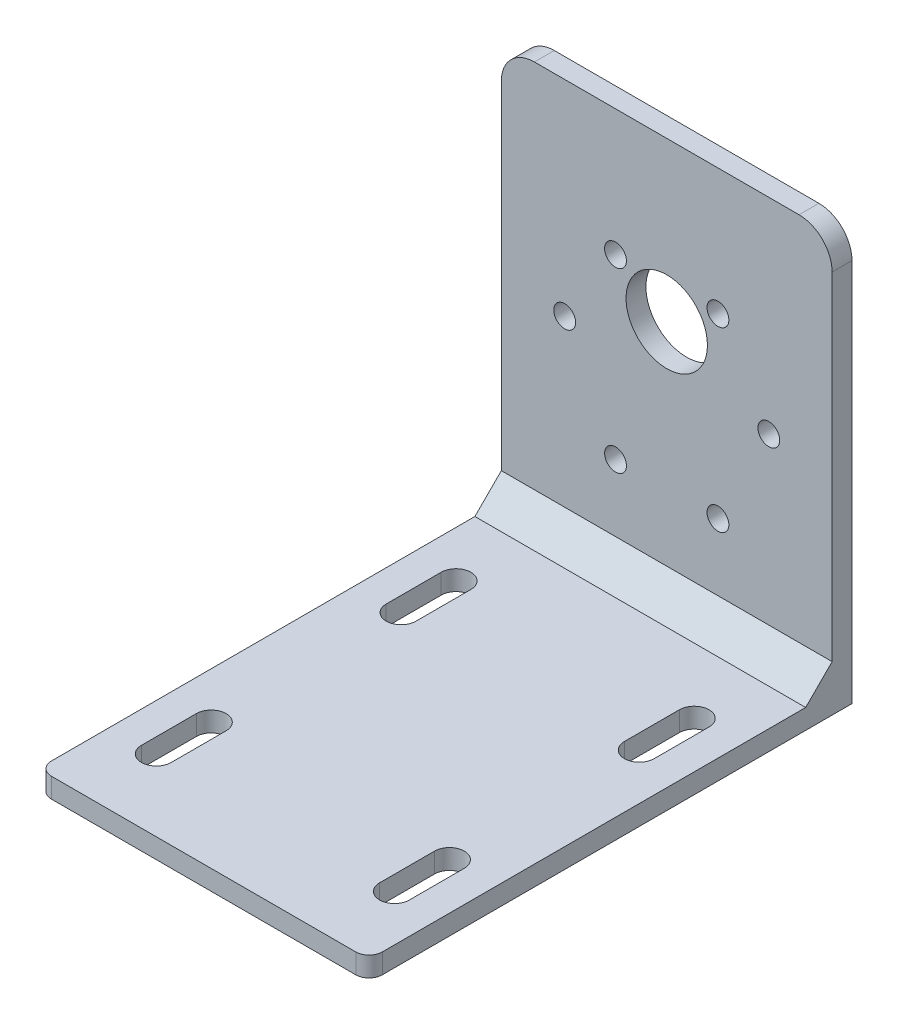
ISO-10303-21;
HEADER;
FILE_DESCRIPTION(('STEP AP214'),'2;1');
FILE_NAME('part.step','',(''),(''),'','','');
FILE_SCHEMA(('AUTOMOTIVE_DESIGN { 1 0 10303 214 1 1 1 1 }'));
ENDSEC;
DATA;
#1=APPLICATION_CONTEXT('core data for automotive mechanical design processes');
#2=APPLICATION_PROTOCOL_DEFINITION('international standard','automotive_design',2000,#1);
#3=PRODUCT_CONTEXT('',#1,'mechanical');
#4=PRODUCT('Part','Part','',(#3));
#5=PRODUCT_RELATED_PRODUCT_CATEGORY('part','',(#4));
#6=PRODUCT_DEFINITION_FORMATION('','',#4);
#7=PRODUCT_DEFINITION_CONTEXT('part definition',#1,'design');
#8=PRODUCT_DEFINITION('design','',#6,#7);
#9=PRODUCT_DEFINITION_SHAPE('','',#8);
#10=(LENGTH_UNIT() NAMED_UNIT(*) SI_UNIT(.MILLI.,.METRE.));
#11=(NAMED_UNIT(*) PLANE_ANGLE_UNIT() SI_UNIT($,.RADIAN.));
#12=(NAMED_UNIT(*) SI_UNIT($,.STERADIAN.) SOLID_ANGLE_UNIT());
#13=UNCERTAINTY_MEASURE_WITH_UNIT(LENGTH_MEASURE(1.E-05),#10,'distance_accuracy_value','');
#14=(GEOMETRIC_REPRESENTATION_CONTEXT(3) GLOBAL_UNCERTAINTY_ASSIGNED_CONTEXT((#13)) GLOBAL_UNIT_ASSIGNED_CONTEXT((#10,
#11,#12)) REPRESENTATION_CONTEXT('',''));
#15=CARTESIAN_POINT('',(0.,0.,0.));
#16=DIRECTION('',(0.,0.,1.));
#17=DIRECTION('',(1.,0.,0.));
#18=AXIS2_PLACEMENT_3D('',#15,#16,#17);
#19=CARTESIAN_POINT('',(25.,-30.,73.));
#20=DIRECTION('',(0.,-1.,0.));
#21=DIRECTION('',(1.,0.,0.));
#22=AXIS2_PLACEMENT_3D('',#19,#20,#21);
#23=PLANE('',#22);
#24=DIRECTION('',(0.,0.,1.));
#25=VECTOR('',#24,1.);
#26=CARTESIAN_POINT('',(-15.75,-30.,16.85));
#27=LINE('',#26,#25);
#28=CARTESIAN_POINT('',(-15.75,-30.,16.85));
#29=VERTEX_POINT('',#28);
#30=CARTESIAN_POINT('',(-15.75,-30.,25.15));
#31=VERTEX_POINT('',#30);
#32=EDGE_CURVE('E848',#29,#31,#27,.T.);
#33=ORIENTED_EDGE('',*,*,#32,.T.);
#34=CARTESIAN_POINT('',(-18.,-30.,25.15));
#35=DIRECTION('',(0.,1.,0.));
#36=DIRECTION('',(-1.,0.,0.));
#37=AXIS2_PLACEMENT_3D('',#34,#35,#36);
#38=CIRCLE('',#37,2.25);
#39=CARTESIAN_POINT('',(-20.25,-30.,25.15));
#40=VERTEX_POINT('',#39);
#41=EDGE_CURVE('E845',#40,#31,#38,.T.);
#42=ORIENTED_EDGE('',*,*,#41,.F.);
#43=DIRECTION('',(0.,0.,1.));
#44=VECTOR('',#43,1.);
#45=CARTESIAN_POINT('',(-20.25,-30.,16.85));
#46=LINE('',#45,#44);
#47=CARTESIAN_POINT('',(-20.25,-30.,16.85));
#48=VERTEX_POINT('',#47);
#49=EDGE_CURVE('E842',#48,#40,#46,.T.);
#50=ORIENTED_EDGE('',*,*,#49,.F.);
#51=CARTESIAN_POINT('',(-18.,-30.,16.85));
#52=DIRECTION('',(0.,1.,0.));
#53=DIRECTION('',(-1.,0.,0.));
#54=AXIS2_PLACEMENT_3D('',#51,#52,#53);
#55=CIRCLE('',#54,2.25);
#56=EDGE_CURVE('E838',#29,#48,#55,.T.);
#57=ORIENTED_EDGE('',*,*,#56,.F.);
#58=EDGE_LOOP('',(#33,#42,#50,#57));
#59=FACE_BOUND('',#58,.T.);
#60=CARTESIAN_POINT('',(18.,-30.,25.15));
#61=DIRECTION('',(0.,-1.,0.));
#62=DIRECTION('',(1.,0.,0.));
#63=AXIS2_PLACEMENT_3D('',#60,#61,#62);
#64=CIRCLE('',#63,2.25);
#65=CARTESIAN_POINT('',(20.25,-30.,25.15));
#66=VERTEX_POINT('',#65);
#67=CARTESIAN_POINT('',(15.75,-30.,25.15));
#68=VERTEX_POINT('',#67);
#69=EDGE_CURVE('E935',#66,#68,#64,.T.);
#70=ORIENTED_EDGE('',*,*,#69,.T.);
#71=DIRECTION('',(0.,0.,1.));
#72=VECTOR('',#71,1.);
#73=CARTESIAN_POINT('',(15.75,-30.,16.85));
#74=LINE('',#73,#72);
#75=CARTESIAN_POINT('',(15.75,-30.,16.85));
#76=VERTEX_POINT('',#75);
#77=EDGE_CURVE('E850',#76,#68,#74,.T.);
#78=ORIENTED_EDGE('',*,*,#77,.F.);
#79=CARTESIAN_POINT('',(18.,-30.,16.85));
#80=DIRECTION('',(0.,-1.,0.));
#81=DIRECTION('',(1.,0.,0.));
#82=AXIS2_PLACEMENT_3D('',#79,#80,#81);
#83=CIRCLE('',#82,2.25);
#84=CARTESIAN_POINT('',(20.25,-30.,16.85));
#85=VERTEX_POINT('',#84);
#86=EDGE_CURVE('E925',#76,#85,#83,.T.);
#87=ORIENTED_EDGE('',*,*,#86,.T.);
#88=DIRECTION('',(0.,0.,1.));
#89=VECTOR('',#88,1.);
#90=CARTESIAN_POINT('',(20.25,-30.,16.85));
#91=LINE('',#90,#89);
#92=EDGE_CURVE('E938',#85,#66,#91,.T.);
#93=ORIENTED_EDGE('',*,*,#92,.T.);
#94=EDGE_LOOP('',(#70,#78,#87,#93));
#95=FACE_BOUND('',#94,.T.);
#96=CARTESIAN_POINT('',(18.,-30.,62.15));
#97=DIRECTION('',(0.,-1.,0.));
#98=DIRECTION('',(1.,0.,0.));
#99=AXIS2_PLACEMENT_3D('',#96,#97,#98);
#100=CIRCLE('',#99,2.25);
#101=CARTESIAN_POINT('',(20.25,-30.,62.15));
#102=VERTEX_POINT('',#101);
#103=CARTESIAN_POINT('',(15.75,-30.,62.15));
#104=VERTEX_POINT('',#103);
#105=EDGE_CURVE('E907',#102,#104,#100,.T.);
#106=ORIENTED_EDGE('',*,*,#105,.T.);
#107=DIRECTION('',(0.,0.,1.));
#108=VECTOR('',#107,1.);
#109=CARTESIAN_POINT('',(15.75,-30.,53.85));
#110=LINE('',#109,#108);
#111=CARTESIAN_POINT('',(15.75,-30.,53.85));
#112=VERTEX_POINT('',#111);
#113=EDGE_CURVE('E904',#112,#104,#110,.T.);
#114=ORIENTED_EDGE('',*,*,#113,.F.);
#115=CARTESIAN_POINT('',(18.,-30.,53.85));
#116=DIRECTION('',(0.,-1.,0.));
#117=DIRECTION('',(1.,0.,0.));
#118=AXIS2_PLACEMENT_3D('',#115,#116,#117);
#119=CIRCLE('',#118,2.25);
#120=CARTESIAN_POINT('',(20.25,-30.,53.85));
#121=VERTEX_POINT('',#120);
#122=EDGE_CURVE('E895',#112,#121,#119,.T.);
#123=ORIENTED_EDGE('',*,*,#122,.T.);
#124=DIRECTION('',(0.,0.,1.));
#125=VECTOR('',#124,1.);
#126=CARTESIAN_POINT('',(20.25,-30.,53.85));
#127=LINE('',#126,#125);
#128=EDGE_CURVE('E910',#121,#102,#127,.T.);
#129=ORIENTED_EDGE('',*,*,#128,.T.);
#130=EDGE_LOOP('',(#106,#114,#123,#129));
#131=FACE_BOUND('',#130,.T.);
#132=DIRECTION('',(0.,0.,1.));
#133=VECTOR('',#132,1.);
#134=CARTESIAN_POINT('',(-15.75,-30.,53.85));
#135=LINE('',#134,#133);
#136=CARTESIAN_POINT('',(-15.75,-30.,53.85));
#137=VERTEX_POINT('',#136);
#138=CARTESIAN_POINT('',(-15.75,-30.,62.15));
#139=VERTEX_POINT('',#138);
#140=EDGE_CURVE('E873',#137,#139,#135,.T.);
#141=ORIENTED_EDGE('',*,*,#140,.T.);
#142=CARTESIAN_POINT('',(-18.,-30.,62.15));
#143=DIRECTION('',(0.,1.,0.));
#144=DIRECTION('',(-1.,0.,0.));
#145=AXIS2_PLACEMENT_3D('',#142,#143,#144);
#146=CIRCLE('',#145,2.25);
#147=CARTESIAN_POINT('',(-20.25,-30.,62.15));
#148=VERTEX_POINT('',#147);
#149=EDGE_CURVE('E877',#148,#139,#146,.T.);
#150=ORIENTED_EDGE('',*,*,#149,.F.);
#151=DIRECTION('',(0.,0.,1.));
#152=VECTOR('',#151,1.);
#153=CARTESIAN_POINT('',(-20.25,-30.,53.85));
#154=LINE('',#153,#152);
#155=CARTESIAN_POINT('',(-20.25,-30.,53.85));
#156=VERTEX_POINT('',#155);
#157=EDGE_CURVE('E880',#156,#148,#154,.T.);
#158=ORIENTED_EDGE('',*,*,#157,.F.);
#159=CARTESIAN_POINT('',(-18.,-30.,53.85));
#160=DIRECTION('',(0.,1.,0.));
#161=DIRECTION('',(-1.,0.,0.));
#162=AXIS2_PLACEMENT_3D('',#159,#160,#161);
#163=CIRCLE('',#162,2.25);
#164=EDGE_CURVE('E862',#137,#156,#163,.T.);
#165=ORIENTED_EDGE('',*,*,#164,.F.);
#166=EDGE_LOOP('',(#141,#150,#158,#165));
#167=FACE_BOUND('',#166,.T.);
#168=DIRECTION('',(1.,0.,0.));
#169=VECTOR('',#168,1.);
#170=CARTESIAN_POINT('',(25.,-30.,7.));
#171=LINE('',#170,#169);
#172=CARTESIAN_POINT('',(-25.,-30.,7.));
#173=VERTEX_POINT('',#172);
#174=CARTESIAN_POINT('',(25.,-30.,7.));
#175=VERTEX_POINT('',#174);
#176=EDGE_CURVE('E223',#173,#175,#171,.T.);
#177=ORIENTED_EDGE('',*,*,#176,.F.);
#178=DIRECTION('',(0.,0.,-1.));
#179=VECTOR('',#178,1.);
#180=CARTESIAN_POINT('',(-25.,-30.,73.));
#181=LINE('',#180,#179);
#182=CARTESIAN_POINT('',(-25.,-30.,71.));
#183=VERTEX_POINT('',#182);
#184=EDGE_CURVE('E233',#183,#173,#181,.T.);
#185=ORIENTED_EDGE('',*,*,#184,.F.);
#186=CARTESIAN_POINT('',(-23.,-30.,71.));
#187=DIRECTION('',(0.,-1.,0.));
#188=DIRECTION('',(1.,0.,0.));
#189=AXIS2_PLACEMENT_3D('',#186,#187,#188);
#190=CIRCLE('',#189,2.);
#191=CARTESIAN_POINT('',(-23.,-30.,73.));
#192=VERTEX_POINT('',#191);
#193=EDGE_CURVE('E45',#183,#192,#190,.F.);
#194=ORIENTED_EDGE('',*,*,#193,.T.);
#195=DIRECTION('',(-1.,0.,0.));
#196=VECTOR('',#195,1.);
#197=CARTESIAN_POINT('',(25.,-30.,73.));
#198=LINE('',#197,#196);
#199=CARTESIAN_POINT('',(23.,-30.,73.));
#200=VERTEX_POINT('',#199);
#201=EDGE_CURVE('E307',#200,#192,#198,.T.);
#202=ORIENTED_EDGE('',*,*,#201,.F.);
#203=CARTESIAN_POINT('',(23.,-30.,71.));
#204=DIRECTION('',(0.,-1.,0.));
#205=DIRECTION('',(1.,0.,0.));
#206=AXIS2_PLACEMENT_3D('',#203,#204,#205);
#207=CIRCLE('',#206,2.);
#208=CARTESIAN_POINT('',(25.,-30.,71.));
#209=VERTEX_POINT('',#208);
#210=EDGE_CURVE('E60',#200,#209,#207,.F.);
#211=ORIENTED_EDGE('',*,*,#210,.T.);
#212=DIRECTION('',(0.,0.,-1.));
#213=VECTOR('',#212,1.);
#214=CARTESIAN_POINT('',(25.,-30.,73.));
#215=LINE('',#214,#213);
#216=EDGE_CURVE('E329',#209,#175,#215,.T.);
#217=ORIENTED_EDGE('',*,*,#216,.T.);
#218=EDGE_LOOP('',(#177,#185,#194,#202,#211,#217));
#219=FACE_BOUND('',#218,.T.);
#220=ADVANCED_FACE('F37',(#59,#95,#131,#167,#219),#23,.F.);
#221=CARTESIAN_POINT('',(0.,0.,3.));
#222=DIRECTION('',(0.,0.,1.));
#223=DIRECTION('',(1.,0.,0.));
#224=AXIS2_PLACEMENT_3D('',#221,#222,#223);
#225=PLANE('',#224);
#226=CARTESIAN_POINT('',(0.,6.,3.));
#227=DIRECTION('',(0.,0.,1.));
#228=DIRECTION('',(1.,0.,0.));
#229=AXIS2_PLACEMENT_3D('',#226,#227,#228);
#230=CIRCLE('',#229,6.15);
#231=CARTESIAN_POINT('',(6.15,6.,3.));
#232=VERTEX_POINT('',#231);
#233=EDGE_CURVE('E278',#232,#232,#230,.T.);
#234=ORIENTED_EDGE('',*,*,#233,.F.);
#235=EDGE_LOOP('',(#234));
#236=FACE_BOUND('',#235,.T.);
#237=CARTESIAN_POINT('',(15.4272486205415,-0.999999999999998,3.));
#238=DIRECTION('',(0.,0.,1.));
#239=DIRECTION('',(1.,0.,0.));
#240=AXIS2_PLACEMENT_3D('',#237,#238,#239);
#241=CIRCLE('',#240,1.65);
#242=CARTESIAN_POINT('',(17.0772486205415,-0.999999999999998,3.));
#243=VERTEX_POINT('',#242);
#244=EDGE_CURVE('E339',#243,#243,#241,.T.);
#245=ORIENTED_EDGE('',*,*,#244,.F.);
#246=EDGE_LOOP('',(#245));
#247=FACE_BOUND('',#246,.T.);
#248=CARTESIAN_POINT('',(7.73986985457829,-15.9058478321005,3.));
#249=DIRECTION('',(0.,0.,1.));
#250=DIRECTION('',(1.,0.,0.));
#251=AXIS2_PLACEMENT_3D('',#248,#249,#250);
#252=CIRCLE('',#251,1.65);
#253=CARTESIAN_POINT('',(9.38986985457828,-15.9058478321005,3.));
#254=VERTEX_POINT('',#253);
#255=EDGE_CURVE('E342',#254,#254,#252,.F.);
#256=ORIENTED_EDGE('',*,*,#255,.T.);
#257=EDGE_LOOP('',(#256));
#258=FACE_BOUND('',#257,.T.);
#259=CARTESIAN_POINT('',(-7.73986985457829,-15.9058478321005,3.));
#260=DIRECTION('',(0.,0.,1.));
#261=DIRECTION('',(1.,0.,0.));
#262=AXIS2_PLACEMENT_3D('',#259,#260,#261);
#263=CIRCLE('',#262,1.65);
#264=CARTESIAN_POINT('',(-6.08986985457829,-15.9058478321005,3.));
#265=VERTEX_POINT('',#264);
#266=EDGE_CURVE('E345',#265,#265,#263,.T.);
#267=ORIENTED_EDGE('',*,*,#266,.F.);
#268=EDGE_LOOP('',(#267));
#269=FACE_BOUND('',#268,.T.);
#270=CARTESIAN_POINT('',(-15.4272486205415,-0.99999999999999,3.));
#271=DIRECTION('',(0.,0.,1.));
#272=DIRECTION('',(1.,0.,0.));
#273=AXIS2_PLACEMENT_3D('',#270,#271,#272);
#274=CIRCLE('',#273,1.65);
#275=CARTESIAN_POINT('',(-13.7772486205415,-0.99999999999999,3.));
#276=VERTEX_POINT('',#275);
#277=EDGE_CURVE('E348',#276,#276,#274,.F.);
#278=ORIENTED_EDGE('',*,*,#277,.T.);
#279=EDGE_LOOP('',(#278));
#280=FACE_BOUND('',#279,.T.);
#281=CARTESIAN_POINT('',(-7.73986985457829,10.9058478321005,3.));
#282=DIRECTION('',(0.,0.,1.));
#283=DIRECTION('',(1.,0.,0.));
#284=AXIS2_PLACEMENT_3D('',#281,#282,#283);
#285=CIRCLE('',#284,1.65);
#286=CARTESIAN_POINT('',(-6.08986985457829,10.9058478321005,3.));
#287=VERTEX_POINT('',#286);
#288=EDGE_CURVE('E351',#287,#287,#285,.F.);
#289=ORIENTED_EDGE('',*,*,#288,.T.);
#290=EDGE_LOOP('',(#289));
#291=FACE_BOUND('',#290,.T.);
#292=CARTESIAN_POINT('',(7.7398698545783,10.9058478321005,3.));
#293=DIRECTION('',(0.,0.,1.));
#294=DIRECTION('',(1.,0.,0.));
#295=AXIS2_PLACEMENT_3D('',#292,#293,#294);
#296=CIRCLE('',#295,1.65);
#297=CARTESIAN_POINT('',(9.3898698545783,10.9058478321005,3.));
#298=VERTEX_POINT('',#297);
#299=EDGE_CURVE('E354',#298,#298,#296,.T.);
#300=ORIENTED_EDGE('',*,*,#299,.F.);
#301=EDGE_LOOP('',(#300));
#302=FACE_BOUND('',#301,.T.);
#303=DIRECTION('',(0.,-1.,0.));
#304=VECTOR('',#303,1.);
#305=CARTESIAN_POINT('',(-25.,0.,3.));
#306=LINE('',#305,#304);
#307=CARTESIAN_POINT('',(-25.,25.,3.));
#308=VERTEX_POINT('',#307);
#309=CARTESIAN_POINT('',(-25.,-26.,3.));
#310=VERTEX_POINT('',#309);
#311=EDGE_CURVE('E230',#308,#310,#306,.T.);
#312=ORIENTED_EDGE('',*,*,#311,.T.);
#313=DIRECTION('',(-1.,0.,0.));
#314=VECTOR('',#313,1.);
#315=CARTESIAN_POINT('',(21.,-26.,3.));
#316=LINE('',#315,#314);
#317=CARTESIAN_POINT('',(25.,-26.,3.));
#318=VERTEX_POINT('',#317);
#319=EDGE_CURVE('E213',#318,#310,#316,.T.);
#320=ORIENTED_EDGE('',*,*,#319,.F.);
#321=DIRECTION('',(0.,-1.,0.));
#322=VECTOR('',#321,1.);
#323=CARTESIAN_POINT('',(25.,0.,3.));
#324=LINE('',#323,#322);
#325=CARTESIAN_POINT('',(25.,25.,3.));
#326=VERTEX_POINT('',#325);
#327=EDGE_CURVE('E245',#326,#318,#324,.T.);
#328=ORIENTED_EDGE('',*,*,#327,.F.);
#329=CARTESIAN_POINT('',(20.,25.,3.));
#330=DIRECTION('',(0.,0.,1.));
#331=DIRECTION('',(1.,0.,0.));
#332=AXIS2_PLACEMENT_3D('',#329,#330,#331);
#333=CIRCLE('',#332,5.);
#334=CARTESIAN_POINT('',(20.,30.,3.));
#335=VERTEX_POINT('',#334);
#336=EDGE_CURVE('E288',#326,#335,#333,.T.);
#337=ORIENTED_EDGE('',*,*,#336,.T.);
#338=DIRECTION('',(1.,0.,0.));
#339=VECTOR('',#338,1.);
#340=CARTESIAN_POINT('',(0.,30.,3.));
#341=LINE('',#340,#339);
#342=CARTESIAN_POINT('',(-20.,30.,3.));
#343=VERTEX_POINT('',#342);
#344=EDGE_CURVE('E240',#343,#335,#341,.T.);
#345=ORIENTED_EDGE('',*,*,#344,.F.);
#346=CARTESIAN_POINT('',(-20.,25.,3.));
#347=DIRECTION('',(0.,0.,1.));
#348=DIRECTION('',(1.,0.,0.));
#349=AXIS2_PLACEMENT_3D('',#346,#347,#348);
#350=CIRCLE('',#349,5.);
#351=EDGE_CURVE('E238',#343,#308,#350,.T.);
#352=ORIENTED_EDGE('',*,*,#351,.T.);
#353=EDGE_LOOP('',(#312,#320,#328,#337,#345,#352));
#354=FACE_BOUND('',#353,.T.);
#355=ADVANCED_FACE('F235',(#236,#247,#258,#269,#280,#291,#302,#354),#225,.T.);
#356=CARTESIAN_POINT('',(0.,-33.,0.));
#357=DIRECTION('',(0.,-1.,0.));
#358=DIRECTION('',(0.,0.,-1.));
#359=AXIS2_PLACEMENT_3D('',#356,#357,#358);
#360=PLANE('',#359);
#361=DIRECTION('',(0.,0.,1.));
#362=VECTOR('',#361,1.);
#363=CARTESIAN_POINT('',(15.75,-33.,53.85));
#364=LINE('',#363,#362);
#365=CARTESIAN_POINT('',(15.75,-33.,53.85));
#366=VERTEX_POINT('',#365);
#367=CARTESIAN_POINT('',(15.75,-33.,62.15));
#368=VERTEX_POINT('',#367);
#369=EDGE_CURVE('E892',#366,#368,#364,.T.);
#370=ORIENTED_EDGE('',*,*,#369,.T.);
#371=CARTESIAN_POINT('',(18.,-33.,62.15));
#372=DIRECTION('',(0.,-1.,0.));
#373=DIRECTION('',(1.,0.,0.));
#374=AXIS2_PLACEMENT_3D('',#371,#372,#373);
#375=CIRCLE('',#374,2.25);
#376=CARTESIAN_POINT('',(20.25,-33.,62.15));
#377=VERTEX_POINT('',#376);
#378=EDGE_CURVE('E896',#377,#368,#375,.T.);
#379=ORIENTED_EDGE('',*,*,#378,.F.);
#380=DIRECTION('',(0.,0.,1.));
#381=VECTOR('',#380,1.);
#382=CARTESIAN_POINT('',(20.25,-33.,53.85));
#383=LINE('',#382,#381);
#384=CARTESIAN_POINT('',(20.25,-33.,53.85));
#385=VERTEX_POINT('',#384);
#386=EDGE_CURVE('E898',#385,#377,#383,.T.);
#387=ORIENTED_EDGE('',*,*,#386,.F.);
#388=CARTESIAN_POINT('',(18.,-33.,53.85));
#389=DIRECTION('',(0.,-1.,0.));
#390=DIRECTION('',(1.,0.,0.));
#391=AXIS2_PLACEMENT_3D('',#388,#389,#390);
#392=CIRCLE('',#391,2.25);
#393=EDGE_CURVE('E901',#366,#385,#392,.T.);
#394=ORIENTED_EDGE('',*,*,#393,.F.);
#395=EDGE_LOOP('',(#370,#379,#387,#394));
#396=FACE_BOUND('',#395,.T.);
#397=DIRECTION('',(0.,0.,1.));
#398=VECTOR('',#397,1.);
#399=CARTESIAN_POINT('',(15.75,-33.,16.85));
#400=LINE('',#399,#398);
#401=CARTESIAN_POINT('',(15.75,-33.,16.85));
#402=VERTEX_POINT('',#401);
#403=CARTESIAN_POINT('',(15.75,-33.,25.15));
#404=VERTEX_POINT('',#403);
#405=EDGE_CURVE('E922',#402,#404,#400,.T.);
#406=ORIENTED_EDGE('',*,*,#405,.T.);
#407=CARTESIAN_POINT('',(18.,-33.,25.15));
#408=DIRECTION('',(0.,-1.,0.));
#409=DIRECTION('',(1.,0.,0.));
#410=AXIS2_PLACEMENT_3D('',#407,#408,#409);
#411=CIRCLE('',#410,2.25);
#412=CARTESIAN_POINT('',(20.25,-33.,25.15));
#413=VERTEX_POINT('',#412);
#414=EDGE_CURVE('E926',#413,#404,#411,.T.);
#415=ORIENTED_EDGE('',*,*,#414,.F.);
#416=DIRECTION('',(0.,0.,1.));
#417=VECTOR('',#416,1.);
#418=CARTESIAN_POINT('',(20.25,-33.,16.85));
#419=LINE('',#418,#417);
#420=CARTESIAN_POINT('',(20.25,-33.,16.85));
#421=VERTEX_POINT('',#420);
#422=EDGE_CURVE('E928',#421,#413,#419,.T.);
#423=ORIENTED_EDGE('',*,*,#422,.F.);
#424=CARTESIAN_POINT('',(18.,-33.,16.85));
#425=DIRECTION('',(0.,-1.,0.));
#426=DIRECTION('',(1.,0.,0.));
#427=AXIS2_PLACEMENT_3D('',#424,#425,#426);
#428=CIRCLE('',#427,2.25);
#429=EDGE_CURVE('E931',#402,#421,#428,.T.);
#430=ORIENTED_EDGE('',*,*,#429,.F.);
#431=EDGE_LOOP('',(#406,#415,#423,#430));
#432=FACE_BOUND('',#431,.T.);
#433=DIRECTION('',(1.,0.,0.));
#434=VECTOR('',#433,1.);
#435=CARTESIAN_POINT('',(-25.,-33.,73.));
#436=LINE('',#435,#434);
#437=CARTESIAN_POINT('',(-23.,-33.,73.));
#438=VERTEX_POINT('',#437);
#439=CARTESIAN_POINT('',(23.,-33.,73.));
#440=VERTEX_POINT('',#439);
#441=EDGE_CURVE('E316',#438,#440,#436,.T.);
#442=ORIENTED_EDGE('',*,*,#441,.F.);
#443=CARTESIAN_POINT('',(-23.,-33.,71.));
#444=DIRECTION('',(0.,-1.,0.));
#445=DIRECTION('',(0.,0.,-1.));
#446=AXIS2_PLACEMENT_3D('',#443,#444,#445);
#447=CIRCLE('',#446,2.);
#448=CARTESIAN_POINT('',(-25.,-33.,71.));
#449=VERTEX_POINT('',#448);
#450=EDGE_CURVE('E301',#438,#449,#447,.T.);
#451=ORIENTED_EDGE('',*,*,#450,.T.);
#452=DIRECTION('',(0.,0.,-1.));
#453=VECTOR('',#452,1.);
#454=CARTESIAN_POINT('',(-25.,-33.,3.));
#455=LINE('',#454,#453);
#456=CARTESIAN_POINT('',(-25.,-33.,0.));
#457=VERTEX_POINT('',#456);
#458=EDGE_CURVE('E325',#449,#457,#455,.T.);
#459=ORIENTED_EDGE('',*,*,#458,.T.);
#460=DIRECTION('',(1.,0.,0.));
#461=VECTOR('',#460,1.);
#462=CARTESIAN_POINT('',(-25.,-33.,0.));
#463=LINE('',#462,#461);
#464=CARTESIAN_POINT('',(25.,-33.,0.));
#465=VERTEX_POINT('',#464);
#466=EDGE_CURVE('E328',#457,#465,#463,.T.);
#467=ORIENTED_EDGE('',*,*,#466,.T.);
#468=DIRECTION('',(0.,0.,1.));
#469=VECTOR('',#468,1.);
#470=CARTESIAN_POINT('',(25.,-33.,0.));
#471=LINE('',#470,#469);
#472=CARTESIAN_POINT('',(25.,-33.,71.));
#473=VERTEX_POINT('',#472);
#474=EDGE_CURVE('E253',#465,#473,#471,.T.);
#475=ORIENTED_EDGE('',*,*,#474,.T.);
#476=CARTESIAN_POINT('',(23.,-33.,71.));
#477=DIRECTION('',(0.,-1.,0.));
#478=DIRECTION('',(0.,0.,-1.));
#479=AXIS2_PLACEMENT_3D('',#476,#477,#478);
#480=CIRCLE('',#479,2.);
#481=EDGE_CURVE('E299',#473,#440,#480,.T.);
#482=ORIENTED_EDGE('',*,*,#481,.T.);
#483=EDGE_LOOP('',(#442,#451,#459,#467,#475,#482));
#484=FACE_BOUND('',#483,.T.);
#485=CARTESIAN_POINT('',(-18.,-33.,25.15));
#486=DIRECTION('',(0.,1.,0.));
#487=DIRECTION('',(-1.,0.,0.));
#488=AXIS2_PLACEMENT_3D('',#485,#486,#487);
#489=CIRCLE('',#488,2.25);
#490=CARTESIAN_POINT('',(-20.25,-33.,25.15));
#491=VERTEX_POINT('',#490);
#492=CARTESIAN_POINT('',(-15.75,-33.,25.15));
#493=VERTEX_POINT('',#492);
#494=EDGE_CURVE('E856',#491,#493,#489,.T.);
#495=ORIENTED_EDGE('',*,*,#494,.T.);
#496=DIRECTION('',(0.,0.,1.));
#497=VECTOR('',#496,1.);
#498=CARTESIAN_POINT('',(-15.75,-33.,16.85));
#499=LINE('',#498,#497);
#500=CARTESIAN_POINT('',(-15.75,-33.,16.85));
#501=VERTEX_POINT('',#500);
#502=EDGE_CURVE('E841',#501,#493,#499,.T.);
#503=ORIENTED_EDGE('',*,*,#502,.F.);
#504=CARTESIAN_POINT('',(-18.,-33.,16.85));
#505=DIRECTION('',(0.,1.,0.));
#506=DIRECTION('',(-1.,0.,0.));
#507=AXIS2_PLACEMENT_3D('',#504,#505,#506);
#508=CIRCLE('',#507,2.25);
#509=CARTESIAN_POINT('',(-20.25,-33.,16.85));
#510=VERTEX_POINT('',#509);
#511=EDGE_CURVE('E837',#501,#510,#508,.T.);
#512=ORIENTED_EDGE('',*,*,#511,.T.);
#513=DIRECTION('',(0.,0.,1.));
#514=VECTOR('',#513,1.);
#515=CARTESIAN_POINT('',(-20.25,-33.,16.85));
#516=LINE('',#515,#514);
#517=EDGE_CURVE('E853',#510,#491,#516,.T.);
#518=ORIENTED_EDGE('',*,*,#517,.T.);
#519=EDGE_LOOP('',(#495,#503,#512,#518));
#520=FACE_BOUND('',#519,.T.);
#521=CARTESIAN_POINT('',(-18.,-33.,62.15));
#522=DIRECTION('',(0.,1.,0.));
#523=DIRECTION('',(-1.,0.,0.));
#524=AXIS2_PLACEMENT_3D('',#521,#522,#523);
#525=CIRCLE('',#524,2.25);
#526=CARTESIAN_POINT('',(-20.25,-33.,62.15));
#527=VERTEX_POINT('',#526);
#528=CARTESIAN_POINT('',(-15.75,-33.,62.15));
#529=VERTEX_POINT('',#528);
#530=EDGE_CURVE('E863',#527,#529,#525,.T.);
#531=ORIENTED_EDGE('',*,*,#530,.T.);
#532=DIRECTION('',(0.,0.,1.));
#533=VECTOR('',#532,1.);
#534=CARTESIAN_POINT('',(-15.75,-33.,53.85));
#535=LINE('',#534,#533);
#536=CARTESIAN_POINT('',(-15.75,-33.,53.85));
#537=VERTEX_POINT('',#536);
#538=EDGE_CURVE('E860',#537,#529,#535,.T.);
#539=ORIENTED_EDGE('',*,*,#538,.F.);
#540=CARTESIAN_POINT('',(-18.,-33.,53.85));
#541=DIRECTION('',(0.,1.,0.));
#542=DIRECTION('',(-1.,0.,0.));
#543=AXIS2_PLACEMENT_3D('',#540,#541,#542);
#544=CIRCLE('',#543,2.25);
#545=CARTESIAN_POINT('',(-20.25,-33.,53.85));
#546=VERTEX_POINT('',#545);
#547=EDGE_CURVE('E869',#537,#546,#544,.T.);
#548=ORIENTED_EDGE('',*,*,#547,.T.);
#549=DIRECTION('',(0.,0.,1.));
#550=VECTOR('',#549,1.);
#551=CARTESIAN_POINT('',(-20.25,-33.,53.85));
#552=LINE('',#551,#550);
#553=EDGE_CURVE('E866',#546,#527,#552,.T.);
#554=ORIENTED_EDGE('',*,*,#553,.T.);
#555=EDGE_LOOP('',(#531,#539,#548,#554));
#556=FACE_BOUND('',#555,.T.);
#557=ADVANCED_FACE('F322',(#396,#432,#484,#520,#556),#360,.T.);
#558=CARTESIAN_POINT('',(25.,0.,3.));
#559=DIRECTION('',(1.,0.,0.));
#560=DIRECTION('',(0.,1.,0.));
#561=AXIS2_PLACEMENT_3D('',#558,#559,#560);
#562=PLANE('',#561);
#563=DIRECTION('',(0.,0.707106781186548,-0.707106781186548));
#564=VECTOR('',#563,1.);
#565=CARTESIAN_POINT('',(25.,-26.,3.));
#566=LINE('',#565,#564);
#567=EDGE_CURVE('E52',#175,#318,#566,.T.);
#568=ORIENTED_EDGE('',*,*,#567,.F.);
#569=ORIENTED_EDGE('',*,*,#216,.F.);
#570=DIRECTION('',(0.,1.,0.));
#571=VECTOR('',#570,1.);
#572=CARTESIAN_POINT('',(25.,0.,71.));
#573=LINE('',#572,#571);
#574=EDGE_CURVE('E12',#209,#473,#573,.F.);
#575=ORIENTED_EDGE('',*,*,#574,.T.);
#576=ORIENTED_EDGE('',*,*,#474,.F.);
#577=DIRECTION('',(0.,-1.,0.));
#578=VECTOR('',#577,1.);
#579=CARTESIAN_POINT('',(25.,0.,0.));
#580=LINE('',#579,#578);
#581=CARTESIAN_POINT('',(25.,25.,0.));
#582=VERTEX_POINT('',#581);
#583=EDGE_CURVE('E271',#582,#465,#580,.T.);
#584=ORIENTED_EDGE('',*,*,#583,.F.);
#585=DIRECTION('',(0.,0.,-1.));
#586=VECTOR('',#585,1.);
#587=CARTESIAN_POINT('',(25.,25.,3.));
#588=LINE('',#587,#586);
#589=EDGE_CURVE('E291',#582,#326,#588,.F.);
#590=ORIENTED_EDGE('',*,*,#589,.T.);
#591=ORIENTED_EDGE('',*,*,#327,.T.);
#592=EDGE_LOOP('',(#568,#569,#575,#576,#584,#590,#591));
#593=FACE_BOUND('',#592,.T.);
#594=ADVANCED_FACE('F357',(#593),#562,.T.);
#595=CARTESIAN_POINT('',(0.,30.,3.));
#596=DIRECTION('',(0.,1.,0.));
#597=DIRECTION('',(0.,0.,1.));
#598=AXIS2_PLACEMENT_3D('',#595,#596,#597);
#599=PLANE('',#598);
#600=DIRECTION('',(1.,0.,0.));
#601=VECTOR('',#600,1.);
#602=CARTESIAN_POINT('',(0.,30.,0.));
#603=LINE('',#602,#601);
#604=CARTESIAN_POINT('',(-20.,30.,0.));
#605=VERTEX_POINT('',#604);
#606=CARTESIAN_POINT('',(20.,30.,0.));
#607=VERTEX_POINT('',#606);
#608=EDGE_CURVE('E273',#605,#607,#603,.T.);
#609=ORIENTED_EDGE('',*,*,#608,.F.);
#610=DIRECTION('',(0.,0.,-1.));
#611=VECTOR('',#610,1.);
#612=CARTESIAN_POINT('',(-20.,30.,3.));
#613=LINE('',#612,#611);
#614=EDGE_CURVE('E286',#605,#343,#613,.F.);
#615=ORIENTED_EDGE('',*,*,#614,.T.);
#616=ORIENTED_EDGE('',*,*,#344,.T.);
#617=DIRECTION('',(0.,0.,-1.));
#618=VECTOR('',#617,1.);
#619=CARTESIAN_POINT('',(20.,30.,3.));
#620=LINE('',#619,#618);
#621=EDGE_CURVE('E283',#335,#607,#620,.T.);
#622=ORIENTED_EDGE('',*,*,#621,.T.);
#623=EDGE_LOOP('',(#609,#615,#616,#622));
#624=FACE_BOUND('',#623,.T.);
#625=ADVANCED_FACE('F366',(#624),#599,.T.);
#626=CARTESIAN_POINT('',(7.7398698545783,10.9058478321005,3.));
#627=DIRECTION('',(0.,0.,-1.));
#628=DIRECTION('',(-1.,0.,0.));
#629=AXIS2_PLACEMENT_3D('',#626,#627,#628);
#630=CYLINDRICAL_SURFACE('',#629,1.65);
#631=ORIENTED_EDGE('',*,*,#299,.T.);
#632=EDGE_LOOP('',(#631));
#633=FACE_BOUND('',#632,.T.);
#634=CARTESIAN_POINT('',(7.7398698545783,10.9058478321005,0.));
#635=DIRECTION('',(0.,0.,1.));
#636=DIRECTION('',(1.,0.,0.));
#637=AXIS2_PLACEMENT_3D('',#634,#635,#636);
#638=CIRCLE('',#637,1.65);
#639=CARTESIAN_POINT('',(9.3898698545783,10.9058478321005,0.));
#640=VERTEX_POINT('',#639);
#641=EDGE_CURVE('E268',#640,#640,#638,.T.);
#642=ORIENTED_EDGE('',*,*,#641,.F.);
#643=EDGE_LOOP('',(#642));
#644=FACE_BOUND('',#643,.T.);
#645=ADVANCED_FACE('F408',(#633,#644),#630,.F.);
#646=CARTESIAN_POINT('',(-7.73986985457829,10.9058478321005,3.));
#647=DIRECTION('',(0.,0.,-1.));
#648=DIRECTION('',(-1.,0.,0.));
#649=AXIS2_PLACEMENT_3D('',#646,#647,#648);
#650=CYLINDRICAL_SURFACE('',#649,1.65);
#651=ORIENTED_EDGE('',*,*,#288,.F.);
#652=EDGE_LOOP('',(#651));
#653=FACE_BOUND('',#652,.T.);
#654=CARTESIAN_POINT('',(-7.73986985457829,10.9058478321005,0.));
#655=DIRECTION('',(0.,0.,1.));
#656=DIRECTION('',(1.,0.,0.));
#657=AXIS2_PLACEMENT_3D('',#654,#655,#656);
#658=CIRCLE('',#657,1.65);
#659=CARTESIAN_POINT('',(-6.08986985457829,10.9058478321005,0.));
#660=VERTEX_POINT('',#659);
#661=EDGE_CURVE('E265',#660,#660,#658,.F.);
#662=ORIENTED_EDGE('',*,*,#661,.T.);
#663=EDGE_LOOP('',(#662));
#664=FACE_BOUND('',#663,.T.);
#665=ADVANCED_FACE('F413',(#653,#664),#650,.F.);
#666=CARTESIAN_POINT('',(-15.4272486205415,-0.99999999999999,3.));
#667=DIRECTION('',(0.,0.,-1.));
#668=DIRECTION('',(-1.,0.,0.));
#669=AXIS2_PLACEMENT_3D('',#666,#667,#668);
#670=CYLINDRICAL_SURFACE('',#669,1.65);
#671=ORIENTED_EDGE('',*,*,#277,.F.);
#672=EDGE_LOOP('',(#671));
#673=FACE_BOUND('',#672,.T.);
#674=CARTESIAN_POINT('',(-15.4272486205415,-0.99999999999999,0.));
#675=DIRECTION('',(0.,0.,1.));
#676=DIRECTION('',(1.,0.,0.));
#677=AXIS2_PLACEMENT_3D('',#674,#675,#676);
#678=CIRCLE('',#677,1.65);
#679=CARTESIAN_POINT('',(-13.7772486205415,-0.99999999999999,0.));
#680=VERTEX_POINT('',#679);
#681=EDGE_CURVE('E262',#680,#680,#678,.F.);
#682=ORIENTED_EDGE('',*,*,#681,.T.);
#683=EDGE_LOOP('',(#682));
#684=FACE_BOUND('',#683,.T.);
#685=ADVANCED_FACE('F417',(#673,#684),#670,.F.);
#686=CARTESIAN_POINT('',(-7.73986985457829,-15.9058478321005,3.));
#687=DIRECTION('',(0.,0.,-1.));
#688=DIRECTION('',(-1.,0.,0.));
#689=AXIS2_PLACEMENT_3D('',#686,#687,#688);
#690=CYLINDRICAL_SURFACE('',#689,1.65);
#691=ORIENTED_EDGE('',*,*,#266,.T.);
#692=EDGE_LOOP('',(#691));
#693=FACE_BOUND('',#692,.T.);
#694=CARTESIAN_POINT('',(-7.73986985457829,-15.9058478321005,0.));
#695=DIRECTION('',(0.,0.,1.));
#696=DIRECTION('',(1.,0.,0.));
#697=AXIS2_PLACEMENT_3D('',#694,#695,#696);
#698=CIRCLE('',#697,1.65);
#699=CARTESIAN_POINT('',(-6.08986985457829,-15.9058478321005,0.));
#700=VERTEX_POINT('',#699);
#701=EDGE_CURVE('E259',#700,#700,#698,.T.);
#702=ORIENTED_EDGE('',*,*,#701,.F.);
#703=EDGE_LOOP('',(#702));
#704=FACE_BOUND('',#703,.T.);
#705=ADVANCED_FACE('F421',(#693,#704),#690,.F.);
#706=CARTESIAN_POINT('',(7.73986985457829,-15.9058478321005,3.));
#707=DIRECTION('',(0.,0.,-1.));
#708=DIRECTION('',(-1.,0.,0.));
#709=AXIS2_PLACEMENT_3D('',#706,#707,#708);
#710=CYLINDRICAL_SURFACE('',#709,1.65);
#711=ORIENTED_EDGE('',*,*,#255,.F.);
#712=EDGE_LOOP('',(#711));
#713=FACE_BOUND('',#712,.T.);
#714=CARTESIAN_POINT('',(7.73986985457829,-15.9058478321005,0.));
#715=DIRECTION('',(0.,0.,1.));
#716=DIRECTION('',(1.,0.,0.));
#717=AXIS2_PLACEMENT_3D('',#714,#715,#716);
#718=CIRCLE('',#717,1.65);
#719=CARTESIAN_POINT('',(9.38986985457828,-15.9058478321005,0.));
#720=VERTEX_POINT('',#719);
#721=EDGE_CURVE('E256',#720,#720,#718,.F.);
#722=ORIENTED_EDGE('',*,*,#721,.T.);
#723=EDGE_LOOP('',(#722));
#724=FACE_BOUND('',#723,.T.);
#725=ADVANCED_FACE('F425',(#713,#724),#710,.F.);
#726=CARTESIAN_POINT('',(15.4272486205415,-0.999999999999998,3.));
#727=DIRECTION('',(0.,0.,-1.));
#728=DIRECTION('',(-1.,0.,0.));
#729=AXIS2_PLACEMENT_3D('',#726,#727,#728);
#730=CYLINDRICAL_SURFACE('',#729,1.65);
#731=ORIENTED_EDGE('',*,*,#244,.T.);
#732=EDGE_LOOP('',(#731));
#733=FACE_BOUND('',#732,.T.);
#734=CARTESIAN_POINT('',(15.4272486205415,-0.999999999999998,0.));
#735=DIRECTION('',(0.,0.,1.));
#736=DIRECTION('',(1.,0.,0.));
#737=AXIS2_PLACEMENT_3D('',#734,#735,#736);
#738=CIRCLE('',#737,1.65);
#739=CARTESIAN_POINT('',(17.0772486205415,-0.999999999999998,0.));
#740=VERTEX_POINT('',#739);
#741=EDGE_CURVE('E252',#740,#740,#738,.T.);
#742=ORIENTED_EDGE('',*,*,#741,.F.);
#743=EDGE_LOOP('',(#742));
#744=FACE_BOUND('',#743,.T.);
#745=ADVANCED_FACE('F429',(#733,#744),#730,.F.);
#746=CARTESIAN_POINT('',(0.,6.,3.));
#747=DIRECTION('',(0.,0.,-1.));
#748=DIRECTION('',(-1.,0.,0.));
#749=AXIS2_PLACEMENT_3D('',#746,#747,#748);
#750=CYLINDRICAL_SURFACE('',#749,6.15);
#751=ORIENTED_EDGE('',*,*,#233,.T.);
#752=EDGE_LOOP('',(#751));
#753=FACE_BOUND('',#752,.T.);
#754=CARTESIAN_POINT('',(0.,6.,0.));
#755=DIRECTION('',(0.,0.,1.));
#756=DIRECTION('',(1.,0.,0.));
#757=AXIS2_PLACEMENT_3D('',#754,#755,#756);
#758=CIRCLE('',#757,6.15);
#759=CARTESIAN_POINT('',(6.15,6.,0.));
#760=VERTEX_POINT('',#759);
#761=EDGE_CURVE('E249',#760,#760,#758,.T.);
#762=ORIENTED_EDGE('',*,*,#761,.F.);
#763=EDGE_LOOP('',(#762));
#764=FACE_BOUND('',#763,.T.);
#765=ADVANCED_FACE('F405',(#753,#764),#750,.F.);
#766=CARTESIAN_POINT('',(-25.,0.,3.));
#767=DIRECTION('',(1.,0.,0.));
#768=DIRECTION('',(0.,1.,0.));
#769=AXIS2_PLACEMENT_3D('',#766,#767,#768);
#770=PLANE('',#769);
#771=ORIENTED_EDGE('',*,*,#184,.T.);
#772=DIRECTION('',(0.,0.707106781186548,-0.707106781186548));
#773=VECTOR('',#772,1.);
#774=CARTESIAN_POINT('',(-25.,-26.,3.));
#775=LINE('',#774,#773);
#776=EDGE_CURVE('E216',#173,#310,#775,.T.);
#777=ORIENTED_EDGE('',*,*,#776,.T.);
#778=ORIENTED_EDGE('',*,*,#311,.F.);
#779=DIRECTION('',(0.,0.,-1.));
#780=VECTOR('',#779,1.);
#781=CARTESIAN_POINT('',(-25.,25.,0.));
#782=LINE('',#781,#780);
#783=CARTESIAN_POINT('',(-25.,25.,0.));
#784=VERTEX_POINT('',#783);
#785=EDGE_CURVE('E239',#308,#784,#782,.T.);
#786=ORIENTED_EDGE('',*,*,#785,.T.);
#787=DIRECTION('',(0.,-1.,0.));
#788=VECTOR('',#787,1.);
#789=CARTESIAN_POINT('',(-25.,0.,0.));
#790=LINE('',#789,#788);
#791=EDGE_CURVE('E276',#784,#457,#790,.T.);
#792=ORIENTED_EDGE('',*,*,#791,.T.);
#793=ORIENTED_EDGE('',*,*,#458,.F.);
#794=DIRECTION('',(0.,-1.,0.));
#795=VECTOR('',#794,1.);
#796=CARTESIAN_POINT('',(-25.,-30.,71.));
#797=LINE('',#796,#795);
#798=EDGE_CURVE('E303',#449,#183,#797,.F.);
#799=ORIENTED_EDGE('',*,*,#798,.T.);
#800=EDGE_LOOP('',(#771,#777,#778,#786,#792,#793,#799));
#801=FACE_BOUND('',#800,.T.);
#802=ADVANCED_FACE('F228',(#801),#770,.F.);
#803=CARTESIAN_POINT('',(0.,0.,0.));
#804=DIRECTION('',(0.,0.,1.));
#805=DIRECTION('',(1.,0.,0.));
#806=AXIS2_PLACEMENT_3D('',#803,#804,#805);
#807=PLANE('',#806);
#808=ORIENTED_EDGE('',*,*,#761,.T.);
#809=EDGE_LOOP('',(#808));
#810=FACE_BOUND('',#809,.T.);
#811=ORIENTED_EDGE('',*,*,#741,.T.);
#812=EDGE_LOOP('',(#811));
#813=FACE_BOUND('',#812,.T.);
#814=ORIENTED_EDGE('',*,*,#721,.F.);
#815=EDGE_LOOP('',(#814));
#816=FACE_BOUND('',#815,.T.);
#817=ORIENTED_EDGE('',*,*,#701,.T.);
#818=EDGE_LOOP('',(#817));
#819=FACE_BOUND('',#818,.T.);
#820=ORIENTED_EDGE('',*,*,#681,.F.);
#821=EDGE_LOOP('',(#820));
#822=FACE_BOUND('',#821,.T.);
#823=ORIENTED_EDGE('',*,*,#661,.F.);
#824=EDGE_LOOP('',(#823));
#825=FACE_BOUND('',#824,.T.);
#826=ORIENTED_EDGE('',*,*,#641,.T.);
#827=EDGE_LOOP('',(#826));
#828=FACE_BOUND('',#827,.T.);
#829=ORIENTED_EDGE('',*,*,#791,.F.);
#830=CARTESIAN_POINT('',(-20.,25.,0.));
#831=DIRECTION('',(0.,0.,1.));
#832=DIRECTION('',(1.,0.,0.));
#833=AXIS2_PLACEMENT_3D('',#830,#831,#832);
#834=CIRCLE('',#833,5.);
#835=EDGE_CURVE('E281',#784,#605,#834,.F.);
#836=ORIENTED_EDGE('',*,*,#835,.T.);
#837=ORIENTED_EDGE('',*,*,#608,.T.);
#838=CARTESIAN_POINT('',(20.,25.,0.));
#839=DIRECTION('',(0.,0.,1.));
#840=DIRECTION('',(1.,0.,0.));
#841=AXIS2_PLACEMENT_3D('',#838,#839,#840);
#842=CIRCLE('',#841,5.);
#843=EDGE_CURVE('E242',#607,#582,#842,.F.);
#844=ORIENTED_EDGE('',*,*,#843,.T.);
#845=ORIENTED_EDGE('',*,*,#583,.T.);
#846=ORIENTED_EDGE('',*,*,#466,.F.);
#847=EDGE_LOOP('',(#829,#836,#837,#844,#845,#846));
#848=FACE_BOUND('',#847,.T.);
#849=ADVANCED_FACE('F369',(#810,#813,#816,#819,#822,#825,#828,#848),#807,.F.);
#850=CARTESIAN_POINT('',(0.,0.,73.));
#851=DIRECTION('',(0.,0.,1.));
#852=DIRECTION('',(1.,0.,0.));
#853=AXIS2_PLACEMENT_3D('',#850,#851,#852);
#854=PLANE('',#853);
#855=ORIENTED_EDGE('',*,*,#201,.T.);
#856=DIRECTION('',(0.,-1.,0.));
#857=VECTOR('',#856,1.);
#858=CARTESIAN_POINT('',(-23.,-33.,73.));
#859=LINE('',#858,#857);
#860=EDGE_CURVE('E296',#192,#438,#859,.T.);
#861=ORIENTED_EDGE('',*,*,#860,.T.);
#862=ORIENTED_EDGE('',*,*,#441,.T.);
#863=DIRECTION('',(0.,1.,0.));
#864=VECTOR('',#863,1.);
#865=CARTESIAN_POINT('',(23.,0.,73.));
#866=LINE('',#865,#864);
#867=EDGE_CURVE('E293',#440,#200,#866,.T.);
#868=ORIENTED_EDGE('',*,*,#867,.T.);
#869=EDGE_LOOP('',(#855,#861,#862,#868));
#870=FACE_BOUND('',#869,.T.);
#871=ADVANCED_FACE('F312',(#870),#854,.T.);
#872=CARTESIAN_POINT('',(-15.75,-33.,16.85));
#873=DIRECTION('',(-1.,0.,0.));
#874=DIRECTION('',(0.,0.,1.));
#875=AXIS2_PLACEMENT_3D('',#872,#873,#874);
#876=PLANE('',#875);
#877=ORIENTED_EDGE('',*,*,#32,.F.);
#878=DIRECTION('',(0.,1.,0.));
#879=VECTOR('',#878,1.);
#880=CARTESIAN_POINT('',(-15.75,-33.,16.85));
#881=LINE('',#880,#879);
#882=EDGE_CURVE('E834',#501,#29,#881,.T.);
#883=ORIENTED_EDGE('',*,*,#882,.F.);
#884=ORIENTED_EDGE('',*,*,#502,.T.);
#885=DIRECTION('',(0.,1.,0.));
#886=VECTOR('',#885,1.);
#887=CARTESIAN_POINT('',(-15.75,-33.,25.15));
#888=LINE('',#887,#886);
#889=EDGE_CURVE('E317',#493,#31,#888,.T.);
#890=ORIENTED_EDGE('',*,*,#889,.T.);
#891=EDGE_LOOP('',(#877,#883,#884,#890));
#892=FACE_BOUND('',#891,.T.);
#893=ADVANCED_FACE('F490',(#892),#876,.T.);
#894=CARTESIAN_POINT('',(-18.,-33.,25.15));
#895=DIRECTION('',(0.,1.,0.));
#896=DIRECTION('',(-1.,0.,0.));
#897=AXIS2_PLACEMENT_3D('',#894,#895,#896);
#898=CYLINDRICAL_SURFACE('',#897,2.25);
#899=ORIENTED_EDGE('',*,*,#41,.T.);
#900=ORIENTED_EDGE('',*,*,#889,.F.);
#901=ORIENTED_EDGE('',*,*,#494,.F.);
#902=DIRECTION('',(0.,1.,0.));
#903=VECTOR('',#902,1.);
#904=CARTESIAN_POINT('',(-20.25,-33.,25.15));
#905=LINE('',#904,#903);
#906=EDGE_CURVE('E830',#491,#40,#905,.T.);
#907=ORIENTED_EDGE('',*,*,#906,.T.);
#908=EDGE_LOOP('',(#899,#900,#901,#907));
#909=FACE_BOUND('',#908,.T.);
#910=ADVANCED_FACE('F497',(#909),#898,.F.);
#911=CARTESIAN_POINT('',(-20.25,-33.,16.85));
#912=DIRECTION('',(-1.,0.,0.));
#913=DIRECTION('',(0.,0.,1.));
#914=AXIS2_PLACEMENT_3D('',#911,#912,#913);
#915=PLANE('',#914);
#916=ORIENTED_EDGE('',*,*,#49,.T.);
#917=ORIENTED_EDGE('',*,*,#906,.F.);
#918=ORIENTED_EDGE('',*,*,#517,.F.);
#919=DIRECTION('',(0.,1.,0.));
#920=VECTOR('',#919,1.);
#921=CARTESIAN_POINT('',(-20.25,-33.,16.85));
#922=LINE('',#921,#920);
#923=EDGE_CURVE('E832',#510,#48,#922,.T.);
#924=ORIENTED_EDGE('',*,*,#923,.T.);
#925=EDGE_LOOP('',(#916,#917,#918,#924));
#926=FACE_BOUND('',#925,.T.);
#927=ADVANCED_FACE('F504',(#926),#915,.F.);
#928=CARTESIAN_POINT('',(-18.,-33.,16.85));
#929=DIRECTION('',(0.,1.,0.));
#930=DIRECTION('',(-1.,0.,0.));
#931=AXIS2_PLACEMENT_3D('',#928,#929,#930);
#932=CYLINDRICAL_SURFACE('',#931,2.25);
#933=ORIENTED_EDGE('',*,*,#56,.T.);
#934=ORIENTED_EDGE('',*,*,#923,.F.);
#935=ORIENTED_EDGE('',*,*,#511,.F.);
#936=ORIENTED_EDGE('',*,*,#882,.T.);
#937=EDGE_LOOP('',(#933,#934,#935,#936));
#938=FACE_BOUND('',#937,.T.);
#939=ADVANCED_FACE('F512',(#938),#932,.F.);
#940=CARTESIAN_POINT('',(15.75,-33.,16.85));
#941=DIRECTION('',(-1.,0.,0.));
#942=DIRECTION('',(0.,0.,1.));
#943=AXIS2_PLACEMENT_3D('',#940,#941,#942);
#944=PLANE('',#943);
#945=ORIENTED_EDGE('',*,*,#77,.T.);
#946=DIRECTION('',(0.,1.,0.));
#947=VECTOR('',#946,1.);
#948=CARTESIAN_POINT('',(15.75,-33.,25.15));
#949=LINE('',#948,#947);
#950=EDGE_CURVE('E933',#404,#68,#949,.T.);
#951=ORIENTED_EDGE('',*,*,#950,.F.);
#952=ORIENTED_EDGE('',*,*,#405,.F.);
#953=DIRECTION('',(0.,1.,0.));
#954=VECTOR('',#953,1.);
#955=CARTESIAN_POINT('',(15.75,-33.,16.85));
#956=LINE('',#955,#954);
#957=EDGE_CURVE('E906',#402,#76,#956,.T.);
#958=ORIENTED_EDGE('',*,*,#957,.T.);
#959=EDGE_LOOP('',(#945,#951,#952,#958));
#960=FACE_BOUND('',#959,.T.);
#961=ADVANCED_FACE('F520',(#960),#944,.F.);
#962=CARTESIAN_POINT('',(18.,-33.,16.85));
#963=DIRECTION('',(0.,1.,0.));
#964=DIRECTION('',(-1.,0.,0.));
#965=AXIS2_PLACEMENT_3D('',#962,#963,#964);
#966=CYLINDRICAL_SURFACE('',#965,2.25);
#967=ORIENTED_EDGE('',*,*,#86,.F.);
#968=ORIENTED_EDGE('',*,*,#957,.F.);
#969=ORIENTED_EDGE('',*,*,#429,.T.);
#970=DIRECTION('',(0.,1.,0.));
#971=VECTOR('',#970,1.);
#972=CARTESIAN_POINT('',(20.25,-33.,16.85));
#973=LINE('',#972,#971);
#974=EDGE_CURVE('E944',#421,#85,#973,.T.);
#975=ORIENTED_EDGE('',*,*,#974,.T.);
#976=EDGE_LOOP('',(#967,#968,#969,#975));
#977=FACE_BOUND('',#976,.T.);
#978=ADVANCED_FACE('F528',(#977),#966,.F.);
#979=CARTESIAN_POINT('',(20.25,-33.,16.85));
#980=DIRECTION('',(-1.,0.,0.));
#981=DIRECTION('',(0.,0.,1.));
#982=AXIS2_PLACEMENT_3D('',#979,#980,#981);
#983=PLANE('',#982);
#984=ORIENTED_EDGE('',*,*,#92,.F.);
#985=ORIENTED_EDGE('',*,*,#974,.F.);
#986=ORIENTED_EDGE('',*,*,#422,.T.);
#987=DIRECTION('',(0.,1.,0.));
#988=VECTOR('',#987,1.);
#989=CARTESIAN_POINT('',(20.25,-33.,25.15));
#990=LINE('',#989,#988);
#991=EDGE_CURVE('E946',#413,#66,#990,.T.);
#992=ORIENTED_EDGE('',*,*,#991,.T.);
#993=EDGE_LOOP('',(#984,#985,#986,#992));
#994=FACE_BOUND('',#993,.T.);
#995=ADVANCED_FACE('F536',(#994),#983,.T.);
#996=CARTESIAN_POINT('',(18.,-33.,25.15));
#997=DIRECTION('',(0.,1.,0.));
#998=DIRECTION('',(-1.,0.,0.));
#999=AXIS2_PLACEMENT_3D('',#996,#997,#998);
#1000=CYLINDRICAL_SURFACE('',#999,2.25);
#1001=ORIENTED_EDGE('',*,*,#69,.F.);
#1002=ORIENTED_EDGE('',*,*,#991,.F.);
#1003=ORIENTED_EDGE('',*,*,#414,.T.);
#1004=ORIENTED_EDGE('',*,*,#950,.T.);
#1005=EDGE_LOOP('',(#1001,#1002,#1003,#1004));
#1006=FACE_BOUND('',#1005,.T.);
#1007=ADVANCED_FACE('F544',(#1006),#1000,.F.);
#1008=CARTESIAN_POINT('',(15.75,-33.,53.85));
#1009=DIRECTION('',(-1.,0.,0.));
#1010=DIRECTION('',(0.,0.,1.));
#1011=AXIS2_PLACEMENT_3D('',#1008,#1009,#1010);
#1012=PLANE('',#1011);
#1013=ORIENTED_EDGE('',*,*,#113,.T.);
#1014=DIRECTION('',(0.,1.,0.));
#1015=VECTOR('',#1014,1.);
#1016=CARTESIAN_POINT('',(15.75,-33.,62.15));
#1017=LINE('',#1016,#1015);
#1018=EDGE_CURVE('E903',#368,#104,#1017,.T.);
#1019=ORIENTED_EDGE('',*,*,#1018,.F.);
#1020=ORIENTED_EDGE('',*,*,#369,.F.);
#1021=DIRECTION('',(0.,1.,0.));
#1022=VECTOR('',#1021,1.);
#1023=CARTESIAN_POINT('',(15.75,-33.,53.85));
#1024=LINE('',#1023,#1022);
#1025=EDGE_CURVE('E876',#366,#112,#1024,.T.);
#1026=ORIENTED_EDGE('',*,*,#1025,.T.);
#1027=EDGE_LOOP('',(#1013,#1019,#1020,#1026));
#1028=FACE_BOUND('',#1027,.T.);
#1029=ADVANCED_FACE('F552',(#1028),#1012,.F.);
#1030=CARTESIAN_POINT('',(18.,-33.,53.85));
#1031=DIRECTION('',(0.,1.,0.));
#1032=DIRECTION('',(-1.,0.,0.));
#1033=AXIS2_PLACEMENT_3D('',#1030,#1031,#1032);
#1034=CYLINDRICAL_SURFACE('',#1033,2.25);
#1035=ORIENTED_EDGE('',*,*,#122,.F.);
#1036=ORIENTED_EDGE('',*,*,#1025,.F.);
#1037=ORIENTED_EDGE('',*,*,#393,.T.);
#1038=DIRECTION('',(0.,1.,0.));
#1039=VECTOR('',#1038,1.);
#1040=CARTESIAN_POINT('',(20.25,-33.,53.85));
#1041=LINE('',#1040,#1039);
#1042=EDGE_CURVE('E916',#385,#121,#1041,.T.);
#1043=ORIENTED_EDGE('',*,*,#1042,.T.);
#1044=EDGE_LOOP('',(#1035,#1036,#1037,#1043));
#1045=FACE_BOUND('',#1044,.T.);
#1046=ADVANCED_FACE('F560',(#1045),#1034,.F.);
#1047=CARTESIAN_POINT('',(20.25,-33.,53.85));
#1048=DIRECTION('',(-1.,0.,0.));
#1049=DIRECTION('',(0.,0.,1.));
#1050=AXIS2_PLACEMENT_3D('',#1047,#1048,#1049);
#1051=PLANE('',#1050);
#1052=ORIENTED_EDGE('',*,*,#128,.F.);
#1053=ORIENTED_EDGE('',*,*,#1042,.F.);
#1054=ORIENTED_EDGE('',*,*,#386,.T.);
#1055=DIRECTION('',(0.,1.,0.));
#1056=VECTOR('',#1055,1.);
#1057=CARTESIAN_POINT('',(20.25,-33.,62.15));
#1058=LINE('',#1057,#1056);
#1059=EDGE_CURVE('E918',#377,#102,#1058,.T.);
#1060=ORIENTED_EDGE('',*,*,#1059,.T.);
#1061=EDGE_LOOP('',(#1052,#1053,#1054,#1060));
#1062=FACE_BOUND('',#1061,.T.);
#1063=ADVANCED_FACE('F568',(#1062),#1051,.T.);
#1064=CARTESIAN_POINT('',(18.,-33.,62.15));
#1065=DIRECTION('',(0.,1.,0.));
#1066=DIRECTION('',(-1.,0.,0.));
#1067=AXIS2_PLACEMENT_3D('',#1064,#1065,#1066);
#1068=CYLINDRICAL_SURFACE('',#1067,2.25);
#1069=ORIENTED_EDGE('',*,*,#105,.F.);
#1070=ORIENTED_EDGE('',*,*,#1059,.F.);
#1071=ORIENTED_EDGE('',*,*,#378,.T.);
#1072=ORIENTED_EDGE('',*,*,#1018,.T.);
#1073=EDGE_LOOP('',(#1069,#1070,#1071,#1072));
#1074=FACE_BOUND('',#1073,.T.);
#1075=ADVANCED_FACE('F576',(#1074),#1068,.F.);
#1076=CARTESIAN_POINT('',(-15.75,-33.,53.85));
#1077=DIRECTION('',(-1.,0.,0.));
#1078=DIRECTION('',(0.,0.,1.));
#1079=AXIS2_PLACEMENT_3D('',#1076,#1077,#1078);
#1080=PLANE('',#1079);
#1081=ORIENTED_EDGE('',*,*,#140,.F.);
#1082=DIRECTION('',(0.,1.,0.));
#1083=VECTOR('',#1082,1.);
#1084=CARTESIAN_POINT('',(-15.75,-33.,53.85));
#1085=LINE('',#1084,#1083);
#1086=EDGE_CURVE('E872',#537,#137,#1085,.T.);
#1087=ORIENTED_EDGE('',*,*,#1086,.F.);
#1088=ORIENTED_EDGE('',*,*,#538,.T.);
#1089=DIRECTION('',(0.,1.,0.));
#1090=VECTOR('',#1089,1.);
#1091=CARTESIAN_POINT('',(-15.75,-33.,62.15));
#1092=LINE('',#1091,#1090);
#1093=EDGE_CURVE('E222',#529,#139,#1092,.T.);
#1094=ORIENTED_EDGE('',*,*,#1093,.T.);
#1095=EDGE_LOOP('',(#1081,#1087,#1088,#1094));
#1096=FACE_BOUND('',#1095,.T.);
#1097=ADVANCED_FACE('F584',(#1096),#1080,.T.);
#1098=CARTESIAN_POINT('',(-18.,-33.,62.15));
#1099=DIRECTION('',(0.,1.,0.));
#1100=DIRECTION('',(-1.,0.,0.));
#1101=AXIS2_PLACEMENT_3D('',#1098,#1099,#1100);
#1102=CYLINDRICAL_SURFACE('',#1101,2.25);
#1103=ORIENTED_EDGE('',*,*,#149,.T.);
#1104=ORIENTED_EDGE('',*,*,#1093,.F.);
#1105=ORIENTED_EDGE('',*,*,#530,.F.);
#1106=DIRECTION('',(0.,1.,0.));
#1107=VECTOR('',#1106,1.);
#1108=CARTESIAN_POINT('',(-20.25,-33.,62.15));
#1109=LINE('',#1108,#1107);
#1110=EDGE_CURVE('E889',#527,#148,#1109,.T.);
#1111=ORIENTED_EDGE('',*,*,#1110,.T.);
#1112=EDGE_LOOP('',(#1103,#1104,#1105,#1111));
#1113=FACE_BOUND('',#1112,.T.);
#1114=ADVANCED_FACE('F592',(#1113),#1102,.F.);
#1115=CARTESIAN_POINT('',(-20.25,-33.,53.85));
#1116=DIRECTION('',(-1.,0.,0.));
#1117=DIRECTION('',(0.,0.,1.));
#1118=AXIS2_PLACEMENT_3D('',#1115,#1116,#1117);
#1119=PLANE('',#1118);
#1120=ORIENTED_EDGE('',*,*,#157,.T.);
#1121=ORIENTED_EDGE('',*,*,#1110,.F.);
#1122=ORIENTED_EDGE('',*,*,#553,.F.);
#1123=DIRECTION('',(0.,1.,0.));
#1124=VECTOR('',#1123,1.);
#1125=CARTESIAN_POINT('',(-20.25,-33.,53.85));
#1126=LINE('',#1125,#1124);
#1127=EDGE_CURVE('E887',#546,#156,#1126,.T.);
#1128=ORIENTED_EDGE('',*,*,#1127,.T.);
#1129=EDGE_LOOP('',(#1120,#1121,#1122,#1128));
#1130=FACE_BOUND('',#1129,.T.);
#1131=ADVANCED_FACE('F380',(#1130),#1119,.F.);
#1132=CARTESIAN_POINT('',(-18.,-33.,53.85));
#1133=DIRECTION('',(0.,1.,0.));
#1134=DIRECTION('',(-1.,0.,0.));
#1135=AXIS2_PLACEMENT_3D('',#1132,#1133,#1134);
#1136=CYLINDRICAL_SURFACE('',#1135,2.25);
#1137=ORIENTED_EDGE('',*,*,#164,.T.);
#1138=ORIENTED_EDGE('',*,*,#1127,.F.);
#1139=ORIENTED_EDGE('',*,*,#547,.F.);
#1140=ORIENTED_EDGE('',*,*,#1086,.T.);
#1141=EDGE_LOOP('',(#1137,#1138,#1139,#1140));
#1142=FACE_BOUND('',#1141,.T.);
#1143=ADVANCED_FACE('F373',(#1142),#1136,.F.);
#1144=CARTESIAN_POINT('',(-20.,25.,3.));
#1145=DIRECTION('',(0.,0.,1.));
#1146=DIRECTION('',(1.,0.,0.));
#1147=AXIS2_PLACEMENT_3D('',#1144,#1145,#1146);
#1148=CYLINDRICAL_SURFACE('',#1147,5.);
#1149=ORIENTED_EDGE('',*,*,#351,.F.);
#1150=ORIENTED_EDGE('',*,*,#614,.F.);
#1151=ORIENTED_EDGE('',*,*,#835,.F.);
#1152=ORIENTED_EDGE('',*,*,#785,.F.);
#1153=EDGE_LOOP('',(#1149,#1150,#1151,#1152));
#1154=FACE_BOUND('',#1153,.T.);
#1155=ADVANCED_FACE('F371',(#1154),#1148,.T.);
#1156=CARTESIAN_POINT('',(20.,25.,3.));
#1157=DIRECTION('',(0.,0.,-1.));
#1158=DIRECTION('',(-1.,0.,0.));
#1159=AXIS2_PLACEMENT_3D('',#1156,#1157,#1158);
#1160=CYLINDRICAL_SURFACE('',#1159,5.);
#1161=ORIENTED_EDGE('',*,*,#336,.F.);
#1162=ORIENTED_EDGE('',*,*,#589,.F.);
#1163=ORIENTED_EDGE('',*,*,#843,.F.);
#1164=ORIENTED_EDGE('',*,*,#621,.F.);
#1165=EDGE_LOOP('',(#1161,#1162,#1163,#1164));
#1166=FACE_BOUND('',#1165,.T.);
#1167=ADVANCED_FACE('F363',(#1166),#1160,.T.);
#1168=CARTESIAN_POINT('',(-23.,0.,71.));
#1169=DIRECTION('',(0.,1.,0.));
#1170=DIRECTION('',(-1.,0.,0.));
#1171=AXIS2_PLACEMENT_3D('',#1168,#1169,#1170);
#1172=CYLINDRICAL_SURFACE('',#1171,2.);
#1173=ORIENTED_EDGE('',*,*,#193,.F.);
#1174=ORIENTED_EDGE('',*,*,#798,.F.);
#1175=ORIENTED_EDGE('',*,*,#450,.F.);
#1176=ORIENTED_EDGE('',*,*,#860,.F.);
#1177=EDGE_LOOP('',(#1173,#1174,#1175,#1176));
#1178=FACE_BOUND('',#1177,.T.);
#1179=ADVANCED_FACE('F319',(#1178),#1172,.T.);
#1180=CARTESIAN_POINT('',(23.,0.,71.));
#1181=DIRECTION('',(0.,1.,0.));
#1182=DIRECTION('',(-1.,0.,0.));
#1183=AXIS2_PLACEMENT_3D('',#1180,#1181,#1182);
#1184=CYLINDRICAL_SURFACE('',#1183,2.);
#1185=ORIENTED_EDGE('',*,*,#481,.F.);
#1186=ORIENTED_EDGE('',*,*,#574,.F.);
#1187=ORIENTED_EDGE('',*,*,#210,.F.);
#1188=ORIENTED_EDGE('',*,*,#867,.F.);
#1189=EDGE_LOOP('',(#1185,#1186,#1187,#1188));
#1190=FACE_BOUND('',#1189,.T.);
#1191=ADVANCED_FACE('F39',(#1190),#1184,.T.);
#1192=CARTESIAN_POINT('',(-25.,-26.,3.));
#1193=DIRECTION('',(0.,-0.707106781186548,-0.707106781186548));
#1194=DIRECTION('',(0.,0.707106781186548,-0.707106781186548));
#1195=AXIS2_PLACEMENT_3D('',#1192,#1193,#1194);
#1196=PLANE('',#1195);
#1197=ORIENTED_EDGE('',*,*,#567,.T.);
#1198=ORIENTED_EDGE('',*,*,#319,.T.);
#1199=ORIENTED_EDGE('',*,*,#776,.F.);
#1200=ORIENTED_EDGE('',*,*,#176,.T.);
#1201=EDGE_LOOP('',(#1197,#1198,#1199,#1200));
#1202=FACE_BOUND('',#1201,.T.);
#1203=ADVANCED_FACE('F215',(#1202),#1196,.F.);
#1204=CLOSED_SHELL('',(#220,#355,#557,#594,#625,#645,#665,#685,#705,#725,#745,#765,#802,#849,
#871,#893,#910,#927,#939,#961,#978,#995,#1007,#1029,#1046,#1063,#1075,#1097,#1114,#1131,#1143,
#1155,#1167,#1179,#1191,#1203));
#1205=MANIFOLD_SOLID_BREP('B2',#1204);
#1206=ADVANCED_BREP_SHAPE_REPRESENTATION('',(#18,#1205),#14);
#1207=SHAPE_DEFINITION_REPRESENTATION(#9,#1206);
ENDSEC;
END-ISO-10303-21;
